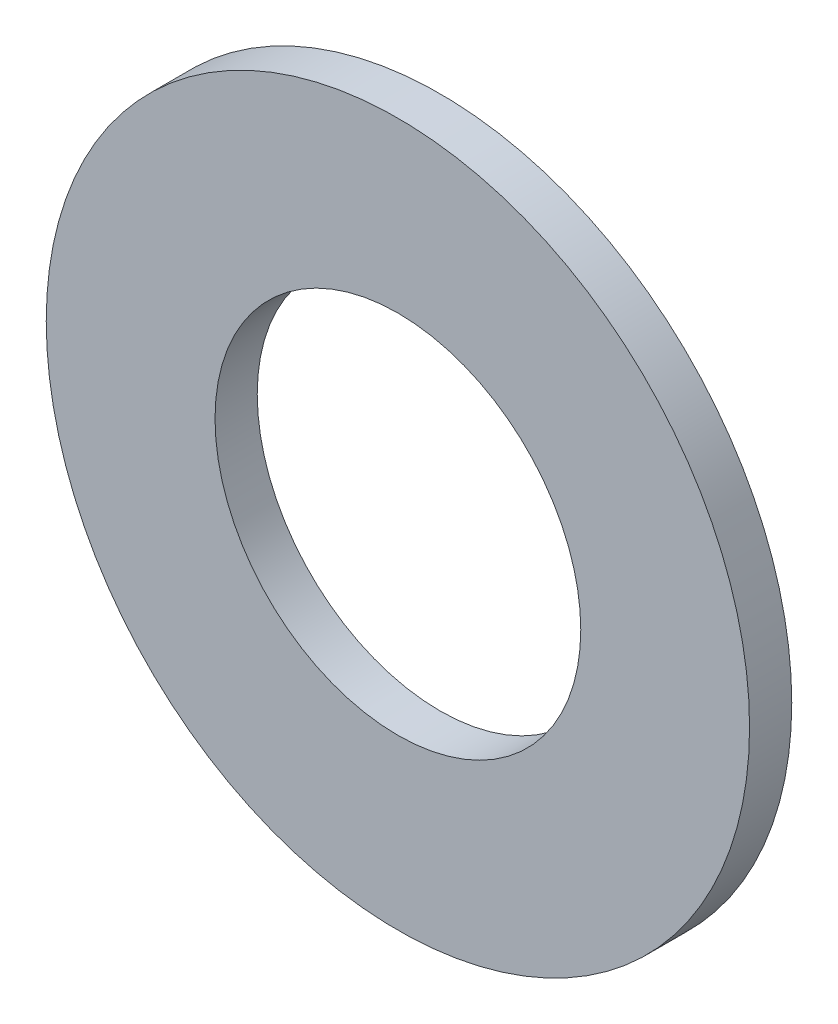
ISO-10303-21;
HEADER;
FILE_DESCRIPTION(('STEP AP214'),'2;1');
FILE_NAME('part.step','',(''),(''),'','','');
FILE_SCHEMA(('AUTOMOTIVE_DESIGN { 1 0 10303 214 1 1 1 1 }'));
ENDSEC;
DATA;
#1=APPLICATION_CONTEXT('core data for automotive mechanical design processes');
#2=APPLICATION_PROTOCOL_DEFINITION('international standard','automotive_design',2000,#1);
#3=PRODUCT_CONTEXT('',#1,'mechanical');
#4=PRODUCT('Part','Part','',(#3));
#5=PRODUCT_RELATED_PRODUCT_CATEGORY('part','',(#4));
#6=PRODUCT_DEFINITION_FORMATION('','',#4);
#7=PRODUCT_DEFINITION_CONTEXT('part definition',#1,'design');
#8=PRODUCT_DEFINITION('design','',#6,#7);
#9=PRODUCT_DEFINITION_SHAPE('','',#8);
#10=(LENGTH_UNIT() NAMED_UNIT(*) SI_UNIT(.MILLI.,.METRE.));
#11=(NAMED_UNIT(*) PLANE_ANGLE_UNIT() SI_UNIT($,.RADIAN.));
#12=(NAMED_UNIT(*) SI_UNIT($,.STERADIAN.) SOLID_ANGLE_UNIT());
#13=UNCERTAINTY_MEASURE_WITH_UNIT(LENGTH_MEASURE(1.E-05),#10,'distance_accuracy_value','');
#14=(GEOMETRIC_REPRESENTATION_CONTEXT(3) GLOBAL_UNCERTAINTY_ASSIGNED_CONTEXT((#13)) GLOBAL_UNIT_ASSIGNED_CONTEXT((#10,
#11,#12)) REPRESENTATION_CONTEXT('',''));
#15=CARTESIAN_POINT('',(0.,0.,0.));
#16=DIRECTION('',(0.,0.,1.));
#17=DIRECTION('',(1.,0.,0.));
#18=AXIS2_PLACEMENT_3D('',#15,#16,#17);
#19=CARTESIAN_POINT('',(0.,0.,0.762));
#20=DIRECTION('',(0.,0.,1.));
#21=DIRECTION('',(1.,0.,0.));
#22=AXIS2_PLACEMENT_3D('',#19,#20,#21);
#23=PLANE('',#22);
#24=CARTESIAN_POINT('',(0.,0.,0.762));
#25=DIRECTION('',(0.,0.,1.));
#26=DIRECTION('',(1.,0.,0.));
#27=AXIS2_PLACEMENT_3D('',#24,#25,#26);
#28=CIRCLE('',#27,6.35);
#29=CARTESIAN_POINT('',(-6.35,0.,0.762));
#30=VERTEX_POINT('',#29);
#31=EDGE_CURVE('E10',#30,#30,#28,.T.);
#32=ORIENTED_EDGE('',*,*,#31,.T.);
#33=EDGE_LOOP('',(#32));
#34=FACE_BOUND('',#33,.T.);
#35=CARTESIAN_POINT('',(0.,0.,0.762));
#36=DIRECTION('',(0.,0.,1.));
#37=DIRECTION('',(1.,0.,0.));
#38=AXIS2_PLACEMENT_3D('',#35,#36,#37);
#39=CIRCLE('',#38,3.302);
#40=CARTESIAN_POINT('',(-3.302,0.,0.762));
#41=VERTEX_POINT('',#40);
#42=EDGE_CURVE('E43',#41,#41,#39,.T.);
#43=ORIENTED_EDGE('',*,*,#42,.F.);
#44=EDGE_LOOP('',(#43));
#45=FACE_BOUND('',#44,.T.);
#46=ADVANCED_FACE('F32',(#34,#45),#23,.T.);
#47=CARTESIAN_POINT('',(0.,0.,0.));
#48=DIRECTION('',(0.,0.,1.));
#49=DIRECTION('',(1.,0.,0.));
#50=AXIS2_PLACEMENT_3D('',#47,#48,#49);
#51=PLANE('',#50);
#52=CARTESIAN_POINT('',(0.,0.,0.));
#53=DIRECTION('',(0.,0.,1.));
#54=DIRECTION('',(1.,0.,0.));
#55=AXIS2_PLACEMENT_3D('',#52,#53,#54);
#56=CIRCLE('',#55,6.35);
#57=CARTESIAN_POINT('',(-6.35,0.,0.));
#58=VERTEX_POINT('',#57);
#59=EDGE_CURVE('E36',#58,#58,#56,.T.);
#60=ORIENTED_EDGE('',*,*,#59,.F.);
#61=EDGE_LOOP('',(#60));
#62=FACE_BOUND('',#61,.T.);
#63=CARTESIAN_POINT('',(0.,0.,0.));
#64=DIRECTION('',(0.,0.,1.));
#65=DIRECTION('',(1.,0.,0.));
#66=AXIS2_PLACEMENT_3D('',#63,#64,#65);
#67=CIRCLE('',#66,3.302);
#68=CARTESIAN_POINT('',(-3.302,0.,0.));
#69=VERTEX_POINT('',#68);
#70=EDGE_CURVE('E45',#69,#69,#67,.T.);
#71=ORIENTED_EDGE('',*,*,#70,.T.);
#72=EDGE_LOOP('',(#71));
#73=FACE_BOUND('',#72,.T.);
#74=ADVANCED_FACE('F55',(#62,#73),#51,.F.);
#75=CARTESIAN_POINT('',(0.,0.,0.762));
#76=DIRECTION('',(0.,0.,-1.));
#77=DIRECTION('',(-1.,0.,0.));
#78=AXIS2_PLACEMENT_3D('',#75,#76,#77);
#79=CYLINDRICAL_SURFACE('',#78,6.35);
#80=CARTESIAN_POINT('',(-6.35,0.,0.762));
#81=CARTESIAN_POINT('',(-6.35,0.,0.7540625));
#82=CARTESIAN_POINT('',(-6.35,0.,0.746125));
#83=CARTESIAN_POINT('',(-6.35,0.,0.73025));
#84=CARTESIAN_POINT('',(-6.35,0.,0.7223125));
#85=CARTESIAN_POINT('',(-6.35,0.,0.7064375));
#86=CARTESIAN_POINT('',(-6.35,0.,0.6985));
#87=CARTESIAN_POINT('',(-6.35,0.,0.682625));
#88=CARTESIAN_POINT('',(-6.35,0.,0.6746875));
#89=CARTESIAN_POINT('',(-6.35,0.,0.6588125));
#90=CARTESIAN_POINT('',(-6.35,0.,0.650875));
#91=CARTESIAN_POINT('',(-6.35,0.,0.635));
#92=CARTESIAN_POINT('',(-6.35,0.,0.6270625));
#93=CARTESIAN_POINT('',(-6.35,0.,0.6111875));
#94=CARTESIAN_POINT('',(-6.35,0.,0.60325));
#95=CARTESIAN_POINT('',(-6.35,0.,0.587375));
#96=CARTESIAN_POINT('',(-6.35,0.,0.5794375));
#97=CARTESIAN_POINT('',(-6.35,0.,0.5635625));
#98=CARTESIAN_POINT('',(-6.35,0.,0.555625));
#99=CARTESIAN_POINT('',(-6.35,0.,0.53975));
#100=CARTESIAN_POINT('',(-6.35,0.,0.5318125));
#101=CARTESIAN_POINT('',(-6.35,0.,0.5159375));
#102=CARTESIAN_POINT('',(-6.35,0.,0.508));
#103=CARTESIAN_POINT('',(-6.35,0.,0.492125));
#104=CARTESIAN_POINT('',(-6.35,0.,0.4841875));
#105=CARTESIAN_POINT('',(-6.35,0.,0.4683125));
#106=CARTESIAN_POINT('',(-6.35,0.,0.460375));
#107=CARTESIAN_POINT('',(-6.35,0.,0.4445));
#108=CARTESIAN_POINT('',(-6.35,0.,0.4365625));
#109=CARTESIAN_POINT('',(-6.35,0.,0.4206875));
#110=CARTESIAN_POINT('',(-6.35,0.,0.41275));
#111=CARTESIAN_POINT('',(-6.35,0.,0.396875));
#112=CARTESIAN_POINT('',(-6.35,0.,0.3889375));
#113=CARTESIAN_POINT('',(-6.35,0.,0.3730625));
#114=CARTESIAN_POINT('',(-6.35,0.,0.365125));
#115=CARTESIAN_POINT('',(-6.35,0.,0.34925));
#116=CARTESIAN_POINT('',(-6.35,0.,0.3413125));
#117=CARTESIAN_POINT('',(-6.35,0.,0.3254375));
#118=CARTESIAN_POINT('',(-6.35,0.,0.3175));
#119=CARTESIAN_POINT('',(-6.35,0.,0.301625));
#120=CARTESIAN_POINT('',(-6.35,0.,0.2936875));
#121=CARTESIAN_POINT('',(-6.35,0.,0.2778125));
#122=CARTESIAN_POINT('',(-6.35,0.,0.269875));
#123=CARTESIAN_POINT('',(-6.35,0.,0.254));
#124=CARTESIAN_POINT('',(-6.35,0.,0.2460625));
#125=CARTESIAN_POINT('',(-6.35,0.,0.2301875));
#126=CARTESIAN_POINT('',(-6.35,0.,0.22225));
#127=CARTESIAN_POINT('',(-6.35,0.,0.206375));
#128=CARTESIAN_POINT('',(-6.35,0.,0.1984375));
#129=CARTESIAN_POINT('',(-6.35,0.,0.1825625));
#130=CARTESIAN_POINT('',(-6.35,0.,0.174625));
#131=CARTESIAN_POINT('',(-6.35,0.,0.15875));
#132=CARTESIAN_POINT('',(-6.35,0.,0.1508125));
#133=CARTESIAN_POINT('',(-6.35,0.,0.1349375));
#134=CARTESIAN_POINT('',(-6.35,0.,0.127));
#135=CARTESIAN_POINT('',(-6.35,0.,0.111125));
#136=CARTESIAN_POINT('',(-6.35,0.,0.1031875));
#137=CARTESIAN_POINT('',(-6.35,0.,0.0873125));
#138=CARTESIAN_POINT('',(-6.35,0.,0.079375));
#139=CARTESIAN_POINT('',(-6.35,0.,0.0635));
#140=CARTESIAN_POINT('',(-6.35,0.,0.0555625));
#141=CARTESIAN_POINT('',(-6.35,0.,0.0396875));
#142=CARTESIAN_POINT('',(-6.35,0.,0.03175));
#143=CARTESIAN_POINT('',(-6.35,0.,0.015875));
#144=CARTESIAN_POINT('',(-6.35,0.,0.00793749999999999));
#145=CARTESIAN_POINT('',(-6.35,0.,0.));
#146=B_SPLINE_CURVE_WITH_KNOTS('',3,(#80,#81,#82,#83,#84,#85,#86,#87,#88,#89,#90,#91,#92,#93,
#94,#95,#96,#97,#98,#99,#100,#101,#102,#103,#104,#105,#106,#107,#108,#109,#110,#111,#112,#113,
#114,#115,#116,#117,#118,#119,#120,#121,#122,#123,#124,#125,#126,#127,#128,#129,#130,#131,#132,
#133,#134,#135,#136,#137,#138,#139,#140,#141,#142,#143,#144,#145),.UNSPECIFIED.,.F.,.F.,(4,2,2,
2,2,2,2,2,2,2,2,2,2,2,2,2,2,2,2,2,2,2,2,2,2,2,2,2,2,2,2,2,4),(0.,0.0238125000000001,0.047625,
0.0714375,0.0952500000000001,0.1190625,0.142875,0.1666875,0.1905,0.2143125,0.238125,0.2619375,
0.28575,0.3095625,0.333375,0.3571875,0.381,0.4048125,0.428625,0.4524375,0.47625,0.5000625,
0.523875,0.5476875,0.5715,0.5953125,0.619125,0.6429375,0.66675,0.6905625,0.714375,0.7381875,
0.762),.UNSPECIFIED.);
#147=EDGE_CURVE('BSEAM34',#30,#58,#146,.T.);
#148=ORIENTED_EDGE('',*,*,#31,.F.);
#149=ORIENTED_EDGE('',*,*,#59,.T.);
#150=ORIENTED_EDGE('',*,*,#147,.T.);
#151=ORIENTED_EDGE('',*,*,#147,.F.);
#152=EDGE_LOOP('',(#148,#150,#149,#151));
#153=FACE_BOUND('',#152,.T.);
#154=ADVANCED_FACE('F34',(#153),#79,.T.);
#155=CARTESIAN_POINT('',(0.,0.,0.762));
#156=DIRECTION('',(0.,0.,-1.));
#157=DIRECTION('',(-1.,0.,0.));
#158=AXIS2_PLACEMENT_3D('',#155,#156,#157);
#159=CYLINDRICAL_SURFACE('',#158,3.302);
#160=CARTESIAN_POINT('',(-3.302,0.,0.762));
#161=CARTESIAN_POINT('',(-3.302,0.,0.7540625));
#162=CARTESIAN_POINT('',(-3.302,0.,0.746125));
#163=CARTESIAN_POINT('',(-3.302,0.,0.73025));
#164=CARTESIAN_POINT('',(-3.302,0.,0.7223125));
#165=CARTESIAN_POINT('',(-3.302,0.,0.7064375));
#166=CARTESIAN_POINT('',(-3.302,0.,0.6985));
#167=CARTESIAN_POINT('',(-3.302,0.,0.682625));
#168=CARTESIAN_POINT('',(-3.302,0.,0.6746875));
#169=CARTESIAN_POINT('',(-3.302,0.,0.6588125));
#170=CARTESIAN_POINT('',(-3.302,0.,0.650875));
#171=CARTESIAN_POINT('',(-3.302,0.,0.635));
#172=CARTESIAN_POINT('',(-3.302,0.,0.6270625));
#173=CARTESIAN_POINT('',(-3.302,0.,0.6111875));
#174=CARTESIAN_POINT('',(-3.302,0.,0.60325));
#175=CARTESIAN_POINT('',(-3.302,0.,0.587375));
#176=CARTESIAN_POINT('',(-3.302,0.,0.5794375));
#177=CARTESIAN_POINT('',(-3.302,0.,0.5635625));
#178=CARTESIAN_POINT('',(-3.302,0.,0.555625));
#179=CARTESIAN_POINT('',(-3.302,0.,0.53975));
#180=CARTESIAN_POINT('',(-3.302,0.,0.5318125));
#181=CARTESIAN_POINT('',(-3.302,0.,0.5159375));
#182=CARTESIAN_POINT('',(-3.302,0.,0.508));
#183=CARTESIAN_POINT('',(-3.302,0.,0.492125));
#184=CARTESIAN_POINT('',(-3.302,0.,0.4841875));
#185=CARTESIAN_POINT('',(-3.302,0.,0.4683125));
#186=CARTESIAN_POINT('',(-3.302,0.,0.460375));
#187=CARTESIAN_POINT('',(-3.302,0.,0.4445));
#188=CARTESIAN_POINT('',(-3.302,0.,0.4365625));
#189=CARTESIAN_POINT('',(-3.302,0.,0.4206875));
#190=CARTESIAN_POINT('',(-3.302,0.,0.41275));
#191=CARTESIAN_POINT('',(-3.302,0.,0.396875));
#192=CARTESIAN_POINT('',(-3.302,0.,0.3889375));
#193=CARTESIAN_POINT('',(-3.302,0.,0.3730625));
#194=CARTESIAN_POINT('',(-3.302,0.,0.365125));
#195=CARTESIAN_POINT('',(-3.302,0.,0.34925));
#196=CARTESIAN_POINT('',(-3.302,0.,0.3413125));
#197=CARTESIAN_POINT('',(-3.302,0.,0.3254375));
#198=CARTESIAN_POINT('',(-3.302,0.,0.3175));
#199=CARTESIAN_POINT('',(-3.302,0.,0.301625));
#200=CARTESIAN_POINT('',(-3.302,0.,0.2936875));
#201=CARTESIAN_POINT('',(-3.302,0.,0.2778125));
#202=CARTESIAN_POINT('',(-3.302,0.,0.269875));
#203=CARTESIAN_POINT('',(-3.302,0.,0.254));
#204=CARTESIAN_POINT('',(-3.302,0.,0.2460625));
#205=CARTESIAN_POINT('',(-3.302,0.,0.2301875));
#206=CARTESIAN_POINT('',(-3.302,0.,0.22225));
#207=CARTESIAN_POINT('',(-3.302,0.,0.206375));
#208=CARTESIAN_POINT('',(-3.302,0.,0.1984375));
#209=CARTESIAN_POINT('',(-3.302,0.,0.1825625));
#210=CARTESIAN_POINT('',(-3.302,0.,0.174625));
#211=CARTESIAN_POINT('',(-3.302,0.,0.15875));
#212=CARTESIAN_POINT('',(-3.302,0.,0.1508125));
#213=CARTESIAN_POINT('',(-3.302,0.,0.1349375));
#214=CARTESIAN_POINT('',(-3.302,0.,0.127));
#215=CARTESIAN_POINT('',(-3.302,0.,0.111125));
#216=CARTESIAN_POINT('',(-3.302,0.,0.1031875));
#217=CARTESIAN_POINT('',(-3.302,0.,0.0873125));
#218=CARTESIAN_POINT('',(-3.302,0.,0.079375));
#219=CARTESIAN_POINT('',(-3.302,0.,0.0635));
#220=CARTESIAN_POINT('',(-3.302,0.,0.0555625));
#221=CARTESIAN_POINT('',(-3.302,0.,0.0396875));
#222=CARTESIAN_POINT('',(-3.302,0.,0.03175));
#223=CARTESIAN_POINT('',(-3.302,0.,0.015875));
#224=CARTESIAN_POINT('',(-3.302,0.,0.00793749999999999));
#225=CARTESIAN_POINT('',(-3.302,0.,0.));
#226=B_SPLINE_CURVE_WITH_KNOTS('',3,(#160,#161,#162,#163,#164,#165,#166,#167,#168,#169,#170,
#171,#172,#173,#174,#175,#176,#177,#178,#179,#180,#181,#182,#183,#184,#185,#186,#187,#188,#189,
#190,#191,#192,#193,#194,#195,#196,#197,#198,#199,#200,#201,#202,#203,#204,#205,#206,#207,#208,
#209,#210,#211,#212,#213,#214,#215,#216,#217,#218,#219,#220,#221,#222,#223,#224,#225),
.UNSPECIFIED.,.F.,.F.,(4,2,2,2,2,2,2,2,2,2,2,2,2,2,2,2,2,2,2,2,2,2,2,2,2,2,2,2,2,2,2,2,4),(0.,
0.0238125,0.0476249999999999,0.0714374999999999,0.09525,0.1190625,0.142875,0.1666875,0.1905,
0.2143125,0.238125,0.2619375,0.28575,0.3095625,0.333375,0.3571875,0.381,0.4048125,0.428625,
0.4524375,0.47625,0.5000625,0.523875,0.5476875,0.5715,0.5953125,0.619125,0.6429375,0.66675,
0.6905625,0.714375,0.7381875,0.762),.UNSPECIFIED.);
#227=EDGE_CURVE('BSEAM51',#41,#69,#226,.T.);
#228=ORIENTED_EDGE('',*,*,#42,.T.);
#229=ORIENTED_EDGE('',*,*,#70,.F.);
#230=ORIENTED_EDGE('',*,*,#227,.T.);
#231=ORIENTED_EDGE('',*,*,#227,.F.);
#232=EDGE_LOOP('',(#228,#230,#229,#231));
#233=FACE_BOUND('',#232,.T.);
#234=ADVANCED_FACE('F51',(#233),#159,.F.);
#235=CLOSED_SHELL('',(#46,#74,#154,#234));
#236=MANIFOLD_SOLID_BREP('B2',#235);
#237=ADVANCED_BREP_SHAPE_REPRESENTATION('',(#18,#236),#14);
#238=SHAPE_DEFINITION_REPRESENTATION(#9,#237);
ENDSEC;
END-ISO-10303-21;
